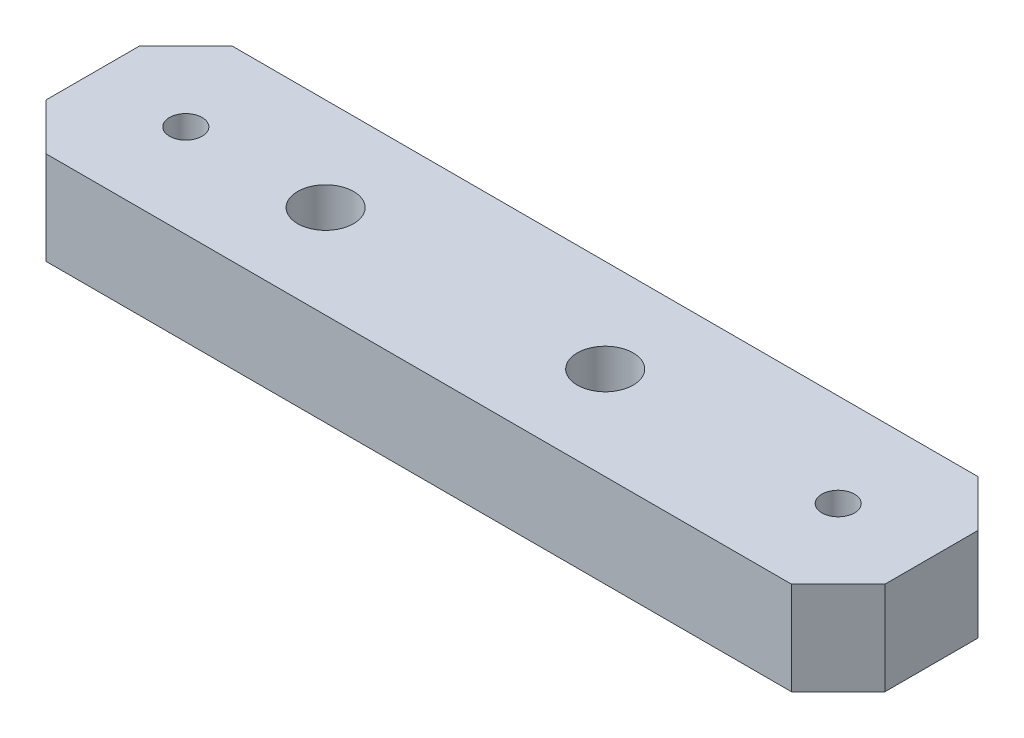
ISO-10303-21;
HEADER;
FILE_DESCRIPTION(('STEP AP214'),'2;1');
FILE_NAME('part.step','',(''),(''),'','','');
FILE_SCHEMA(('AUTOMOTIVE_DESIGN { 1 0 10303 214 1 1 1 1 }'));
ENDSEC;
DATA;
#1=APPLICATION_CONTEXT('core data for automotive mechanical design processes');
#2=APPLICATION_PROTOCOL_DEFINITION('international standard','automotive_design',2000,#1);
#3=PRODUCT_CONTEXT('',#1,'mechanical');
#4=PRODUCT('Part','Part','',(#3));
#5=PRODUCT_RELATED_PRODUCT_CATEGORY('part','',(#4));
#6=PRODUCT_DEFINITION_FORMATION('','',#4);
#7=PRODUCT_DEFINITION_CONTEXT('part definition',#1,'design');
#8=PRODUCT_DEFINITION('design','',#6,#7);
#9=PRODUCT_DEFINITION_SHAPE('','',#8);
#10=(LENGTH_UNIT() NAMED_UNIT(*) SI_UNIT(.MILLI.,.METRE.));
#11=(NAMED_UNIT(*) PLANE_ANGLE_UNIT() SI_UNIT($,.RADIAN.));
#12=(NAMED_UNIT(*) SI_UNIT($,.STERADIAN.) SOLID_ANGLE_UNIT());
#13=UNCERTAINTY_MEASURE_WITH_UNIT(LENGTH_MEASURE(1.E-05),#10,'distance_accuracy_value','');
#14=(GEOMETRIC_REPRESENTATION_CONTEXT(3) GLOBAL_UNCERTAINTY_ASSIGNED_CONTEXT((#13)) GLOBAL_UNIT_ASSIGNED_CONTEXT((#10,
#11,#12)) REPRESENTATION_CONTEXT('',''));
#15=CARTESIAN_POINT('',(0.,0.,0.));
#16=DIRECTION('',(0.,0.,1.));
#17=DIRECTION('',(1.,0.,0.));
#18=AXIS2_PLACEMENT_3D('',#15,#16,#17);
#19=CARTESIAN_POINT('',(-10.,10.,10.));
#20=DIRECTION('',(0.,1.,0.));
#21=DIRECTION('',(0.,0.,1.));
#22=AXIS2_PLACEMENT_3D('',#19,#20,#21);
#23=PLANE('',#22);
#24=CARTESIAN_POINT('',(15.,10.,0.));
#25=DIRECTION('',(0.,1.,0.));
#26=DIRECTION('',(0.,0.,1.));
#27=AXIS2_PLACEMENT_3D('',#24,#25,#26);
#28=CIRCLE('',#27,3.);
#29=CARTESIAN_POINT('',(15.,10.,3.));
#30=VERTEX_POINT('',#29);
#31=EDGE_CURVE('E184',#30,#30,#28,.T.);
#32=ORIENTED_EDGE('',*,*,#31,.F.);
#33=EDGE_LOOP('',(#32));
#34=FACE_BOUND('',#33,.T.);
#35=CARTESIAN_POINT('',(0.,10.,0.));
#36=DIRECTION('',(0.,1.,0.));
#37=DIRECTION('',(0.,0.,1.));
#38=AXIS2_PLACEMENT_3D('',#35,#36,#37);
#39=CIRCLE('',#38,1.75);
#40=CARTESIAN_POINT('',(0.,10.,1.75));
#41=VERTEX_POINT('',#40);
#42=EDGE_CURVE('E125',#41,#41,#39,.T.);
#43=ORIENTED_EDGE('',*,*,#42,.F.);
#44=EDGE_LOOP('',(#43));
#45=FACE_BOUND('',#44,.T.);
#46=DIRECTION('',(-1.,0.,0.));
#47=VECTOR('',#46,1.);
#48=CARTESIAN_POINT('',(-10.,10.,-10.));
#49=LINE('',#48,#47);
#50=CARTESIAN_POINT('',(75.,10.,-10.));
#51=VERTEX_POINT('',#50);
#52=CARTESIAN_POINT('',(-4.99999999999998,10.,-10.));
#53=VERTEX_POINT('',#52);
#54=EDGE_CURVE('E134',#51,#53,#49,.T.);
#55=ORIENTED_EDGE('',*,*,#54,.T.);
#56=DIRECTION('',(0.70710678118655,0.,-0.707106781186546));
#57=VECTOR('',#56,1.);
#58=CARTESIAN_POINT('',(-17.5,10.,2.49999999999995));
#59=LINE('',#58,#57);
#60=CARTESIAN_POINT('',(-10.,10.,-5.00000000000001));
#61=VERTEX_POINT('',#60);
#62=EDGE_CURVE('E153',#53,#61,#59,.F.);
#63=ORIENTED_EDGE('',*,*,#62,.T.);
#64=DIRECTION('',(0.,0.,1.));
#65=VECTOR('',#64,1.);
#66=CARTESIAN_POINT('',(-10.,10.,-10.));
#67=LINE('',#66,#65);
#68=CARTESIAN_POINT('',(-10.,10.,4.99999999999998));
#69=VERTEX_POINT('',#68);
#70=EDGE_CURVE('E117',#61,#69,#67,.T.);
#71=ORIENTED_EDGE('',*,*,#70,.T.);
#72=DIRECTION('',(-0.707106781186546,0.,-0.70710678118655));
#73=VECTOR('',#72,1.);
#74=CARTESIAN_POINT('',(-7.49999999999999,10.,7.50000000000001));
#75=LINE('',#74,#73);
#76=CARTESIAN_POINT('',(-5.00000000000001,10.,10.));
#77=VERTEX_POINT('',#76);
#78=EDGE_CURVE('E148',#69,#77,#75,.F.);
#79=ORIENTED_EDGE('',*,*,#78,.T.);
#80=DIRECTION('',(1.,0.,0.));
#81=VECTOR('',#80,1.);
#82=CARTESIAN_POINT('',(-10.,10.,10.));
#83=LINE('',#82,#81);
#84=CARTESIAN_POINT('',(75.,10.,10.));
#85=VERTEX_POINT('',#84);
#86=EDGE_CURVE('E164',#77,#85,#83,.T.);
#87=ORIENTED_EDGE('',*,*,#86,.T.);
#88=DIRECTION('',(-0.70710678118655,0.,0.707106781186546));
#89=VECTOR('',#88,1.);
#90=CARTESIAN_POINT('',(32.4999999999998,10.,52.5));
#91=LINE('',#90,#89);
#92=CARTESIAN_POINT('',(80.,10.,5.));
#93=VERTEX_POINT('',#92);
#94=EDGE_CURVE('E53',#85,#93,#91,.F.);
#95=ORIENTED_EDGE('',*,*,#94,.T.);
#96=DIRECTION('',(0.,0.,-1.));
#97=VECTOR('',#96,1.);
#98=CARTESIAN_POINT('',(80.,10.,-10.));
#99=LINE('',#98,#97);
#100=CARTESIAN_POINT('',(80.,10.,-4.99999999999997));
#101=VERTEX_POINT('',#100);
#102=EDGE_CURVE('E172',#93,#101,#99,.T.);
#103=ORIENTED_EDGE('',*,*,#102,.T.);
#104=DIRECTION('',(0.707106781186548,0.,0.707106781186548));
#105=VECTOR('',#104,1.);
#106=CARTESIAN_POINT('',(42.5,10.,-42.5));
#107=LINE('',#106,#105);
#108=EDGE_CURVE('E151',#101,#51,#107,.F.);
#109=ORIENTED_EDGE('',*,*,#108,.T.);
#110=EDGE_LOOP('',(#55,#63,#71,#79,#87,#95,#103,#109));
#111=FACE_BOUND('',#110,.T.);
#112=CARTESIAN_POINT('',(70.,10.,0.));
#113=DIRECTION('',(0.,1.,0.));
#114=DIRECTION('',(0.,0.,1.));
#115=AXIS2_PLACEMENT_3D('',#112,#113,#114);
#116=CIRCLE('',#115,1.75);
#117=CARTESIAN_POINT('',(70.,10.,1.75));
#118=VERTEX_POINT('',#117);
#119=EDGE_CURVE('E179',#118,#118,#116,.T.);
#120=ORIENTED_EDGE('',*,*,#119,.F.);
#121=EDGE_LOOP('',(#120));
#122=FACE_BOUND('',#121,.T.);
#123=CARTESIAN_POINT('',(45.,10.,0.));
#124=DIRECTION('',(0.,1.,0.));
#125=DIRECTION('',(0.,0.,1.));
#126=AXIS2_PLACEMENT_3D('',#123,#124,#125);
#127=CIRCLE('',#126,3.);
#128=CARTESIAN_POINT('',(45.,10.,3.));
#129=VERTEX_POINT('',#128);
#130=EDGE_CURVE('E190',#129,#129,#127,.T.);
#131=ORIENTED_EDGE('',*,*,#130,.F.);
#132=EDGE_LOOP('',(#131));
#133=FACE_BOUND('',#132,.T.);
#134=ADVANCED_FACE('F31',(#34,#45,#111,#122,#133),#23,.T.);
#135=CARTESIAN_POINT('',(-10.,0.,10.));
#136=DIRECTION('',(0.,1.,0.));
#137=DIRECTION('',(0.,0.,1.));
#138=AXIS2_PLACEMENT_3D('',#135,#136,#137);
#139=PLANE('',#138);
#140=CARTESIAN_POINT('',(15.,0.,0.));
#141=DIRECTION('',(0.,1.,0.));
#142=DIRECTION('',(0.,0.,1.));
#143=AXIS2_PLACEMENT_3D('',#140,#141,#142);
#144=CIRCLE('',#143,3.);
#145=CARTESIAN_POINT('',(15.,0.,3.));
#146=VERTEX_POINT('',#145);
#147=EDGE_CURVE('E187',#146,#146,#144,.T.);
#148=ORIENTED_EDGE('',*,*,#147,.T.);
#149=EDGE_LOOP('',(#148));
#150=FACE_BOUND('',#149,.T.);
#151=CARTESIAN_POINT('',(0.,0.,0.));
#152=DIRECTION('',(0.,1.,0.));
#153=DIRECTION('',(0.,0.,1.));
#154=AXIS2_PLACEMENT_3D('',#151,#152,#153);
#155=CIRCLE('',#154,1.75);
#156=CARTESIAN_POINT('',(0.,0.,1.75));
#157=VERTEX_POINT('',#156);
#158=EDGE_CURVE('E131',#157,#157,#155,.T.);
#159=ORIENTED_EDGE('',*,*,#158,.T.);
#160=EDGE_LOOP('',(#159));
#161=FACE_BOUND('',#160,.T.);
#162=DIRECTION('',(0.,0.,1.));
#163=VECTOR('',#162,1.);
#164=CARTESIAN_POINT('',(-10.,0.,-10.));
#165=LINE('',#164,#163);
#166=CARTESIAN_POINT('',(-10.,0.,-5.00000000000001));
#167=VERTEX_POINT('',#166);
#168=CARTESIAN_POINT('',(-10.,0.,4.99999999999998));
#169=VERTEX_POINT('',#168);
#170=EDGE_CURVE('E114',#167,#169,#165,.T.);
#171=ORIENTED_EDGE('',*,*,#170,.F.);
#172=DIRECTION('',(-0.70710678118655,0.,0.707106781186546));
#173=VECTOR('',#172,1.);
#174=CARTESIAN_POINT('',(-10.,0.,-5.00000000000001));
#175=LINE('',#174,#173);
#176=CARTESIAN_POINT('',(-4.99999999999998,0.,-10.));
#177=VERTEX_POINT('',#176);
#178=EDGE_CURVE('E97',#167,#177,#175,.F.);
#179=ORIENTED_EDGE('',*,*,#178,.T.);
#180=DIRECTION('',(-1.,0.,0.));
#181=VECTOR('',#180,1.);
#182=CARTESIAN_POINT('',(-10.,0.,-10.));
#183=LINE('',#182,#181);
#184=CARTESIAN_POINT('',(75.,0.,-10.));
#185=VERTEX_POINT('',#184);
#186=EDGE_CURVE('E138',#185,#177,#183,.T.);
#187=ORIENTED_EDGE('',*,*,#186,.F.);
#188=DIRECTION('',(-0.707106781186548,0.,-0.707106781186548));
#189=VECTOR('',#188,1.);
#190=CARTESIAN_POINT('',(75.,0.,-10.));
#191=LINE('',#190,#189);
#192=CARTESIAN_POINT('',(80.,0.,-4.99999999999998));
#193=VERTEX_POINT('',#192);
#194=EDGE_CURVE('E108',#185,#193,#191,.F.);
#195=ORIENTED_EDGE('',*,*,#194,.T.);
#196=DIRECTION('',(0.,0.,-1.));
#197=VECTOR('',#196,1.);
#198=CARTESIAN_POINT('',(80.,0.,-10.));
#199=LINE('',#198,#197);
#200=CARTESIAN_POINT('',(80.,0.,5.00000000000001));
#201=VERTEX_POINT('',#200);
#202=EDGE_CURVE('E128',#201,#193,#199,.T.);
#203=ORIENTED_EDGE('',*,*,#202,.F.);
#204=DIRECTION('',(0.70710678118655,0.,-0.707106781186546));
#205=VECTOR('',#204,1.);
#206=CARTESIAN_POINT('',(80.,0.,5.00000000000001));
#207=LINE('',#206,#205);
#208=CARTESIAN_POINT('',(75.,0.,10.));
#209=VERTEX_POINT('',#208);
#210=EDGE_CURVE('E142',#201,#209,#207,.F.);
#211=ORIENTED_EDGE('',*,*,#210,.T.);
#212=DIRECTION('',(1.,0.,0.));
#213=VECTOR('',#212,1.);
#214=CARTESIAN_POINT('',(-10.,0.,10.));
#215=LINE('',#214,#213);
#216=CARTESIAN_POINT('',(-5.00000000000001,0.,10.));
#217=VERTEX_POINT('',#216);
#218=EDGE_CURVE('E124',#217,#209,#215,.T.);
#219=ORIENTED_EDGE('',*,*,#218,.F.);
#220=DIRECTION('',(0.707106781186546,0.,0.70710678118655));
#221=VECTOR('',#220,1.);
#222=CARTESIAN_POINT('',(-5.00000000000001,0.,10.));
#223=LINE('',#222,#221);
#224=EDGE_CURVE('E118',#217,#169,#223,.F.);
#225=ORIENTED_EDGE('',*,*,#224,.T.);
#226=EDGE_LOOP('',(#171,#179,#187,#195,#203,#211,#219,#225));
#227=FACE_BOUND('',#226,.T.);
#228=CARTESIAN_POINT('',(70.,0.,0.));
#229=DIRECTION('',(0.,1.,0.));
#230=DIRECTION('',(0.,0.,1.));
#231=AXIS2_PLACEMENT_3D('',#228,#229,#230);
#232=CIRCLE('',#231,1.75);
#233=CARTESIAN_POINT('',(70.,0.,1.75));
#234=VERTEX_POINT('',#233);
#235=EDGE_CURVE('E181',#234,#234,#232,.T.);
#236=ORIENTED_EDGE('',*,*,#235,.T.);
#237=EDGE_LOOP('',(#236));
#238=FACE_BOUND('',#237,.T.);
#239=CARTESIAN_POINT('',(45.,0.,0.));
#240=DIRECTION('',(0.,1.,0.));
#241=DIRECTION('',(0.,0.,1.));
#242=AXIS2_PLACEMENT_3D('',#239,#240,#241);
#243=CIRCLE('',#242,3.);
#244=CARTESIAN_POINT('',(45.,0.,3.));
#245=VERTEX_POINT('',#244);
#246=EDGE_CURVE('E193',#245,#245,#243,.T.);
#247=ORIENTED_EDGE('',*,*,#246,.T.);
#248=EDGE_LOOP('',(#247));
#249=FACE_BOUND('',#248,.T.);
#250=ADVANCED_FACE('F121',(#150,#161,#227,#238,#249),#139,.F.);
#251=CARTESIAN_POINT('',(-10.,10.,-10.));
#252=DIRECTION('',(1.,0.,0.));
#253=DIRECTION('',(0.,0.,-1.));
#254=AXIS2_PLACEMENT_3D('',#251,#252,#253);
#255=PLANE('',#254);
#256=ORIENTED_EDGE('',*,*,#70,.F.);
#257=DIRECTION('',(0.,-1.,0.));
#258=VECTOR('',#257,1.);
#259=CARTESIAN_POINT('',(-10.,10.,-5.00000000000001));
#260=LINE('',#259,#258);
#261=EDGE_CURVE('E101',#61,#167,#260,.T.);
#262=ORIENTED_EDGE('',*,*,#261,.T.);
#263=ORIENTED_EDGE('',*,*,#170,.T.);
#264=DIRECTION('',(0.,1.,0.));
#265=VECTOR('',#264,1.);
#266=CARTESIAN_POINT('',(-10.,10.,4.99999999999998));
#267=LINE('',#266,#265);
#268=EDGE_CURVE('E119',#169,#69,#267,.T.);
#269=ORIENTED_EDGE('',*,*,#268,.T.);
#270=EDGE_LOOP('',(#256,#262,#263,#269));
#271=FACE_BOUND('',#270,.T.);
#272=ADVANCED_FACE('F113',(#271),#255,.F.);
#273=CARTESIAN_POINT('',(-10.,10.,10.));
#274=DIRECTION('',(0.,0.,-1.));
#275=DIRECTION('',(-1.,0.,0.));
#276=AXIS2_PLACEMENT_3D('',#273,#274,#275);
#277=PLANE('',#276);
#278=ORIENTED_EDGE('',*,*,#218,.T.);
#279=DIRECTION('',(0.,1.,0.));
#280=VECTOR('',#279,1.);
#281=CARTESIAN_POINT('',(75.,10.,10.));
#282=LINE('',#281,#280);
#283=EDGE_CURVE('E11',#209,#85,#282,.T.);
#284=ORIENTED_EDGE('',*,*,#283,.T.);
#285=ORIENTED_EDGE('',*,*,#86,.F.);
#286=DIRECTION('',(0.,-1.,0.));
#287=VECTOR('',#286,1.);
#288=CARTESIAN_POINT('',(-5.00000000000001,10.,10.));
#289=LINE('',#288,#287);
#290=EDGE_CURVE('E39',#77,#217,#289,.T.);
#291=ORIENTED_EDGE('',*,*,#290,.T.);
#292=EDGE_LOOP('',(#278,#284,#285,#291));
#293=FACE_BOUND('',#292,.T.);
#294=ADVANCED_FACE('F162',(#293),#277,.F.);
#295=CARTESIAN_POINT('',(80.,10.,-10.));
#296=DIRECTION('',(-1.,0.,0.));
#297=DIRECTION('',(0.,0.,1.));
#298=AXIS2_PLACEMENT_3D('',#295,#296,#297);
#299=PLANE('',#298);
#300=ORIENTED_EDGE('',*,*,#202,.T.);
#301=DIRECTION('',(0.,1.,0.));
#302=VECTOR('',#301,1.);
#303=CARTESIAN_POINT('',(80.,10.,-4.99999999999998));
#304=LINE('',#303,#302);
#305=EDGE_CURVE('E46',#193,#101,#304,.T.);
#306=ORIENTED_EDGE('',*,*,#305,.T.);
#307=ORIENTED_EDGE('',*,*,#102,.F.);
#308=DIRECTION('',(0.,-1.,0.));
#309=VECTOR('',#308,1.);
#310=CARTESIAN_POINT('',(80.,10.,5.00000000000001));
#311=LINE('',#310,#309);
#312=EDGE_CURVE('E155',#93,#201,#311,.T.);
#313=ORIENTED_EDGE('',*,*,#312,.T.);
#314=EDGE_LOOP('',(#300,#306,#307,#313));
#315=FACE_BOUND('',#314,.T.);
#316=ADVANCED_FACE('F171',(#315),#299,.F.);
#317=CARTESIAN_POINT('',(-10.,10.,-10.));
#318=DIRECTION('',(0.,0.,1.));
#319=DIRECTION('',(1.,0.,0.));
#320=AXIS2_PLACEMENT_3D('',#317,#318,#319);
#321=PLANE('',#320);
#322=ORIENTED_EDGE('',*,*,#186,.T.);
#323=DIRECTION('',(0.,1.,0.));
#324=VECTOR('',#323,1.);
#325=CARTESIAN_POINT('',(-4.99999999999998,10.,-10.));
#326=LINE('',#325,#324);
#327=EDGE_CURVE('E102',#177,#53,#326,.T.);
#328=ORIENTED_EDGE('',*,*,#327,.T.);
#329=ORIENTED_EDGE('',*,*,#54,.F.);
#330=DIRECTION('',(0.,-1.,0.));
#331=VECTOR('',#330,1.);
#332=CARTESIAN_POINT('',(75.,10.,-10.));
#333=LINE('',#332,#331);
#334=EDGE_CURVE('E107',#51,#185,#333,.T.);
#335=ORIENTED_EDGE('',*,*,#334,.T.);
#336=EDGE_LOOP('',(#322,#328,#329,#335));
#337=FACE_BOUND('',#336,.T.);
#338=ADVANCED_FACE('F216',(#337),#321,.F.);
#339=CARTESIAN_POINT('',(0.,10.,0.));
#340=DIRECTION('',(0.,-1.,0.));
#341=DIRECTION('',(0.,0.,-1.));
#342=AXIS2_PLACEMENT_3D('',#339,#340,#341);
#343=CYLINDRICAL_SURFACE('',#342,1.75);
#344=ORIENTED_EDGE('',*,*,#42,.T.);
#345=EDGE_LOOP('',(#344));
#346=FACE_BOUND('',#345,.T.);
#347=ORIENTED_EDGE('',*,*,#158,.F.);
#348=EDGE_LOOP('',(#347));
#349=FACE_BOUND('',#348,.T.);
#350=ADVANCED_FACE('F213',(#346,#349),#343,.F.);
#351=CARTESIAN_POINT('',(70.,10.,0.));
#352=DIRECTION('',(0.,-1.,0.));
#353=DIRECTION('',(0.,0.,-1.));
#354=AXIS2_PLACEMENT_3D('',#351,#352,#353);
#355=CYLINDRICAL_SURFACE('',#354,1.75);
#356=ORIENTED_EDGE('',*,*,#119,.T.);
#357=EDGE_LOOP('',(#356));
#358=FACE_BOUND('',#357,.T.);
#359=ORIENTED_EDGE('',*,*,#235,.F.);
#360=EDGE_LOOP('',(#359));
#361=FACE_BOUND('',#360,.T.);
#362=ADVANCED_FACE('F242',(#358,#361),#355,.F.);
#363=CARTESIAN_POINT('',(15.,10.,0.));
#364=DIRECTION('',(0.,-1.,0.));
#365=DIRECTION('',(0.,0.,-1.));
#366=AXIS2_PLACEMENT_3D('',#363,#364,#365);
#367=CYLINDRICAL_SURFACE('',#366,3.);
#368=ORIENTED_EDGE('',*,*,#31,.T.);
#369=EDGE_LOOP('',(#368));
#370=FACE_BOUND('',#369,.T.);
#371=ORIENTED_EDGE('',*,*,#147,.F.);
#372=EDGE_LOOP('',(#371));
#373=FACE_BOUND('',#372,.T.);
#374=ADVANCED_FACE('F245',(#370,#373),#367,.F.);
#375=CARTESIAN_POINT('',(45.,10.,0.));
#376=DIRECTION('',(0.,-1.,0.));
#377=DIRECTION('',(0.,0.,-1.));
#378=AXIS2_PLACEMENT_3D('',#375,#376,#377);
#379=CYLINDRICAL_SURFACE('',#378,3.);
#380=ORIENTED_EDGE('',*,*,#130,.T.);
#381=EDGE_LOOP('',(#380));
#382=FACE_BOUND('',#381,.T.);
#383=ORIENTED_EDGE('',*,*,#246,.F.);
#384=EDGE_LOOP('',(#383));
#385=FACE_BOUND('',#384,.T.);
#386=ADVANCED_FACE('F199',(#382,#385),#379,.F.);
#387=CARTESIAN_POINT('',(-10.,10.,-5.00000000000001));
#388=DIRECTION('',(0.707106781186545,0.,0.707106781186549));
#389=DIRECTION('',(0.70710678118655,0.,-0.707106781186546));
#390=AXIS2_PLACEMENT_3D('',#387,#388,#389);
#391=PLANE('',#390);
#392=ORIENTED_EDGE('',*,*,#62,.F.);
#393=ORIENTED_EDGE('',*,*,#327,.F.);
#394=ORIENTED_EDGE('',*,*,#178,.F.);
#395=ORIENTED_EDGE('',*,*,#261,.F.);
#396=EDGE_LOOP('',(#392,#393,#394,#395));
#397=FACE_BOUND('',#396,.T.);
#398=ADVANCED_FACE('F100',(#397),#391,.F.);
#399=CARTESIAN_POINT('',(75.,10.,-10.));
#400=DIRECTION('',(-0.707106781186547,0.,0.707106781186547));
#401=DIRECTION('',(0.707106781186548,0.,0.707106781186548));
#402=AXIS2_PLACEMENT_3D('',#399,#400,#401);
#403=PLANE('',#402);
#404=ORIENTED_EDGE('',*,*,#108,.F.);
#405=ORIENTED_EDGE('',*,*,#305,.F.);
#406=ORIENTED_EDGE('',*,*,#194,.F.);
#407=ORIENTED_EDGE('',*,*,#334,.F.);
#408=EDGE_LOOP('',(#404,#405,#406,#407));
#409=FACE_BOUND('',#408,.T.);
#410=ADVANCED_FACE('F228',(#409),#403,.F.);
#411=CARTESIAN_POINT('',(80.,10.,5.00000000000001));
#412=DIRECTION('',(-0.707106781186545,0.,-0.707106781186549));
#413=DIRECTION('',(-0.70710678118655,0.,0.707106781186546));
#414=AXIS2_PLACEMENT_3D('',#411,#412,#413);
#415=PLANE('',#414);
#416=ORIENTED_EDGE('',*,*,#94,.F.);
#417=ORIENTED_EDGE('',*,*,#283,.F.);
#418=ORIENTED_EDGE('',*,*,#210,.F.);
#419=ORIENTED_EDGE('',*,*,#312,.F.);
#420=EDGE_LOOP('',(#416,#417,#418,#419));
#421=FACE_BOUND('',#420,.T.);
#422=ADVANCED_FACE('F170',(#421),#415,.F.);
#423=CARTESIAN_POINT('',(-5.00000000000001,10.,10.));
#424=DIRECTION('',(0.707106781186549,0.,-0.707106781186545));
#425=DIRECTION('',(-0.707106781186546,0.,-0.70710678118655));
#426=AXIS2_PLACEMENT_3D('',#423,#424,#425);
#427=PLANE('',#426);
#428=ORIENTED_EDGE('',*,*,#78,.F.);
#429=ORIENTED_EDGE('',*,*,#268,.F.);
#430=ORIENTED_EDGE('',*,*,#224,.F.);
#431=ORIENTED_EDGE('',*,*,#290,.F.);
#432=EDGE_LOOP('',(#428,#429,#430,#431));
#433=FACE_BOUND('',#432,.T.);
#434=ADVANCED_FACE('F33',(#433),#427,.F.);
#435=CLOSED_SHELL('',(#134,#250,#272,#294,#316,#338,#350,#362,#374,#386,#398,#410,#422,#434));
#436=MANIFOLD_SOLID_BREP('B2',#435);
#437=ADVANCED_BREP_SHAPE_REPRESENTATION('',(#18,#436),#14);
#438=SHAPE_DEFINITION_REPRESENTATION(#9,#437);
ENDSEC;
END-ISO-10303-21;
